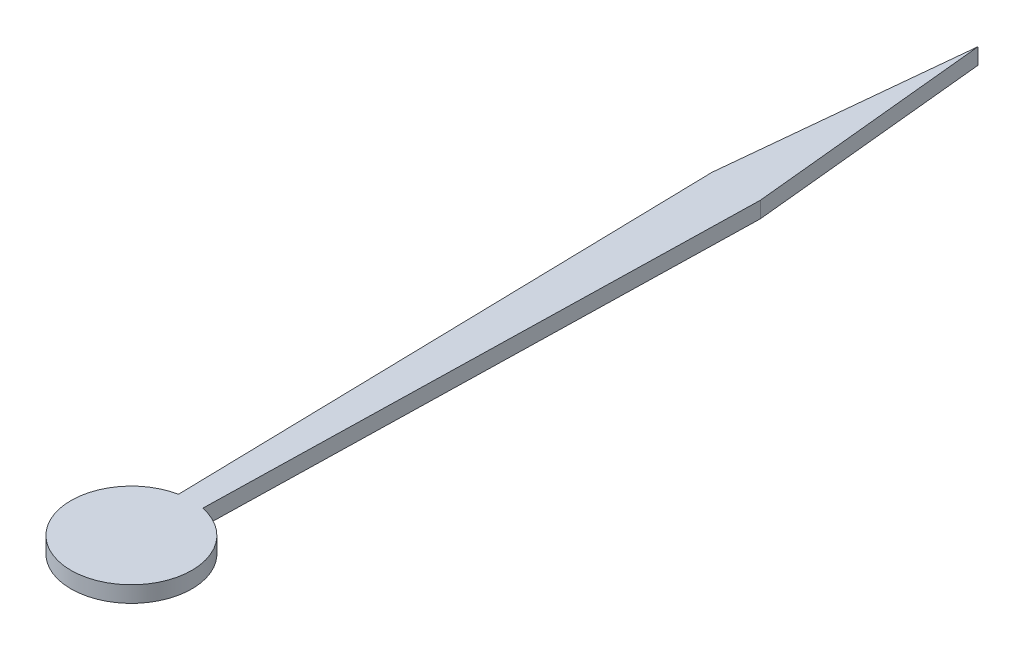
ISO-10303-21;
HEADER;
FILE_DESCRIPTION(('STEP AP214'),'2;1');
FILE_NAME('part.step','',(''),(''),'','','');
FILE_SCHEMA(('AUTOMOTIVE_DESIGN { 1 0 10303 214 1 1 1 1 }'));
ENDSEC;
DATA;
#1=APPLICATION_CONTEXT('core data for automotive mechanical design processes');
#2=APPLICATION_PROTOCOL_DEFINITION('international standard','automotive_design',2000,#1);
#3=PRODUCT_CONTEXT('',#1,'mechanical');
#4=PRODUCT('Part','Part','',(#3));
#5=PRODUCT_RELATED_PRODUCT_CATEGORY('part','',(#4));
#6=PRODUCT_DEFINITION_FORMATION('','',#4);
#7=PRODUCT_DEFINITION_CONTEXT('part definition',#1,'design');
#8=PRODUCT_DEFINITION('design','',#6,#7);
#9=PRODUCT_DEFINITION_SHAPE('','',#8);
#10=(LENGTH_UNIT() NAMED_UNIT(*) SI_UNIT(.MILLI.,.METRE.));
#11=(NAMED_UNIT(*) PLANE_ANGLE_UNIT() SI_UNIT($,.RADIAN.));
#12=(NAMED_UNIT(*) SI_UNIT($,.STERADIAN.) SOLID_ANGLE_UNIT());
#13=UNCERTAINTY_MEASURE_WITH_UNIT(LENGTH_MEASURE(1.E-05),#10,'distance_accuracy_value','');
#14=(GEOMETRIC_REPRESENTATION_CONTEXT(3) GLOBAL_UNCERTAINTY_ASSIGNED_CONTEXT((#13)) GLOBAL_UNIT_ASSIGNED_CONTEXT((#10,
#11,#12)) REPRESENTATION_CONTEXT('',''));
#15=CARTESIAN_POINT('',(0.,0.,0.));
#16=DIRECTION('',(0.,0.,1.));
#17=DIRECTION('',(1.,0.,0.));
#18=AXIS2_PLACEMENT_3D('',#15,#16,#17);
#19=CARTESIAN_POINT('',(0.,0.2,-10.5));
#20=DIRECTION('',(0.995037190209989,0.,0.0995037190209989));
#21=DIRECTION('',(0.0995037190209989,0.,-0.995037190209989));
#22=AXIS2_PLACEMENT_3D('',#19,#20,#21);
#23=PLANE('',#22);
#24=DIRECTION('',(-0.0995037190209989,0.,0.995037190209989));
#25=VECTOR('',#24,1.);
#26=CARTESIAN_POINT('',(0.,0.,-10.5));
#27=LINE('',#26,#25);
#28=CARTESIAN_POINT('',(0.,0.,-10.5));
#29=VERTEX_POINT('',#28);
#30=CARTESIAN_POINT('',(-0.3,0.,-7.5));
#31=VERTEX_POINT('',#30);
#32=EDGE_CURVE('E111',#29,#31,#27,.T.);
#33=ORIENTED_EDGE('',*,*,#32,.T.);
#34=DIRECTION('',(0.,-1.,0.));
#35=VECTOR('',#34,1.);
#36=CARTESIAN_POINT('',(-0.3,0.2,-7.5));
#37=LINE('',#36,#35);
#38=CARTESIAN_POINT('',(-0.3,0.2,-7.5));
#39=VERTEX_POINT('',#38);
#40=EDGE_CURVE('E11',#39,#31,#37,.T.);
#41=ORIENTED_EDGE('',*,*,#40,.F.);
#42=DIRECTION('',(-0.0995037190209989,0.,0.995037190209989));
#43=VECTOR('',#42,1.);
#44=CARTESIAN_POINT('',(0.,0.2,-10.5));
#45=LINE('',#44,#43);
#46=CARTESIAN_POINT('',(0.,0.2,-10.5));
#47=VERTEX_POINT('',#46);
#48=EDGE_CURVE('E119',#47,#39,#45,.T.);
#49=ORIENTED_EDGE('',*,*,#48,.F.);
#50=DIRECTION('',(0.,-1.,0.));
#51=VECTOR('',#50,1.);
#52=CARTESIAN_POINT('',(0.,0.2,-10.5));
#53=LINE('',#52,#51);
#54=EDGE_CURVE('E107',#47,#29,#53,.T.);
#55=ORIENTED_EDGE('',*,*,#54,.T.);
#56=EDGE_LOOP('',(#33,#41,#49,#55));
#57=FACE_BOUND('',#56,.T.);
#58=ADVANCED_FACE('F37',(#57),#23,.F.);
#59=CARTESIAN_POINT('',(-0.3,0.2,-7.5));
#60=DIRECTION('',(0.999754281886394,0.,-0.0221669991162715));
#61=DIRECTION('',(-0.0221669991162715,0.,-0.999754281886394));
#62=AXIS2_PLACEMENT_3D('',#59,#60,#61);
#63=PLANE('',#62);
#64=DIRECTION('',(0.0221669991162715,0.,0.999754281886394));
#65=VECTOR('',#64,1.);
#66=CARTESIAN_POINT('',(-0.3,0.,-7.5));
#67=LINE('',#66,#65);
#68=CARTESIAN_POINT('',(-0.15,0.,-0.734846922834953));
#69=VERTEX_POINT('',#68);
#70=EDGE_CURVE('E114',#31,#69,#67,.T.);
#71=ORIENTED_EDGE('',*,*,#70,.T.);
#72=DIRECTION('',(0.,-1.,0.));
#73=VECTOR('',#72,1.);
#74=CARTESIAN_POINT('',(-0.15,0.2,-0.734846922834953));
#75=LINE('',#74,#73);
#76=CARTESIAN_POINT('',(-0.15,0.2,-0.734846922834953));
#77=VERTEX_POINT('',#76);
#78=EDGE_CURVE('E45',#77,#69,#75,.T.);
#79=ORIENTED_EDGE('',*,*,#78,.F.);
#80=DIRECTION('',(0.0221669991162715,0.,0.999754281886394));
#81=VECTOR('',#80,1.);
#82=CARTESIAN_POINT('',(-0.3,0.2,-7.5));
#83=LINE('',#82,#81);
#84=EDGE_CURVE('E87',#39,#77,#83,.T.);
#85=ORIENTED_EDGE('',*,*,#84,.F.);
#86=ORIENTED_EDGE('',*,*,#40,.T.);
#87=EDGE_LOOP('',(#71,#79,#85,#86));
#88=FACE_BOUND('',#87,.T.);
#89=ADVANCED_FACE('F138',(#88),#63,.F.);
#90=CARTESIAN_POINT('',(0.,0.2,0.));
#91=DIRECTION('',(0.,-1.,0.));
#92=DIRECTION('',(0.,0.,-1.));
#93=AXIS2_PLACEMENT_3D('',#90,#91,#92);
#94=CYLINDRICAL_SURFACE('',#93,0.75);
#95=CARTESIAN_POINT('',(0.,0.,0.));
#96=DIRECTION('',(0.,1.,0.));
#97=DIRECTION('',(0.,0.,1.));
#98=AXIS2_PLACEMENT_3D('',#95,#96,#97);
#99=CIRCLE('',#98,0.75);
#100=CARTESIAN_POINT('',(0.15,0.,-0.734846922834953));
#101=VERTEX_POINT('',#100);
#102=EDGE_CURVE('E102',#69,#101,#99,.T.);
#103=ORIENTED_EDGE('',*,*,#102,.T.);
#104=DIRECTION('',(0.,-1.,0.));
#105=VECTOR('',#104,1.);
#106=CARTESIAN_POINT('',(0.15,0.2,-0.734846922834953));
#107=LINE('',#106,#105);
#108=CARTESIAN_POINT('',(0.15,0.2,-0.734846922834953));
#109=VERTEX_POINT('',#108);
#110=EDGE_CURVE('E99',#109,#101,#107,.T.);
#111=ORIENTED_EDGE('',*,*,#110,.F.);
#112=CARTESIAN_POINT('',(0.,0.2,0.));
#113=DIRECTION('',(0.,1.,0.));
#114=DIRECTION('',(0.,0.,1.));
#115=AXIS2_PLACEMENT_3D('',#112,#113,#114);
#116=CIRCLE('',#115,0.75);
#117=EDGE_CURVE('E91',#77,#109,#116,.T.);
#118=ORIENTED_EDGE('',*,*,#117,.F.);
#119=ORIENTED_EDGE('',*,*,#78,.T.);
#120=EDGE_LOOP('',(#103,#111,#118,#119));
#121=FACE_BOUND('',#120,.T.);
#122=ADVANCED_FACE('F100',(#121),#94,.T.);
#123=CARTESIAN_POINT('',(0.3,0.2,-7.5));
#124=DIRECTION('',(-0.999754281886394,0.,-0.0221669991162715));
#125=DIRECTION('',(-0.0221669991162715,0.,0.999754281886394));
#126=AXIS2_PLACEMENT_3D('',#123,#124,#125);
#127=PLANE('',#126);
#128=DIRECTION('',(0.0221669991162715,0.,-0.999754281886394));
#129=VECTOR('',#128,1.);
#130=CARTESIAN_POINT('',(0.3,0.,-7.5));
#131=LINE('',#130,#129);
#132=CARTESIAN_POINT('',(0.3,0.,-7.5));
#133=VERTEX_POINT('',#132);
#134=EDGE_CURVE('E73',#101,#133,#131,.T.);
#135=ORIENTED_EDGE('',*,*,#134,.T.);
#136=DIRECTION('',(0.,-1.,0.));
#137=VECTOR('',#136,1.);
#138=CARTESIAN_POINT('',(0.3,0.2,-7.5));
#139=LINE('',#138,#137);
#140=CARTESIAN_POINT('',(0.3,0.2,-7.5));
#141=VERTEX_POINT('',#140);
#142=EDGE_CURVE('E103',#141,#133,#139,.T.);
#143=ORIENTED_EDGE('',*,*,#142,.F.);
#144=DIRECTION('',(0.0221669991162715,0.,-0.999754281886394));
#145=VECTOR('',#144,1.);
#146=CARTESIAN_POINT('',(0.3,0.2,-7.5));
#147=LINE('',#146,#145);
#148=EDGE_CURVE('E95',#109,#141,#147,.T.);
#149=ORIENTED_EDGE('',*,*,#148,.F.);
#150=ORIENTED_EDGE('',*,*,#110,.T.);
#151=EDGE_LOOP('',(#135,#143,#149,#150));
#152=FACE_BOUND('',#151,.T.);
#153=ADVANCED_FACE('F105',(#152),#127,.F.);
#154=CARTESIAN_POINT('',(0.,0.2,-10.5));
#155=DIRECTION('',(-0.995037190209989,0.,0.0995037190209989));
#156=DIRECTION('',(0.0995037190209989,0.,0.995037190209989));
#157=AXIS2_PLACEMENT_3D('',#154,#155,#156);
#158=PLANE('',#157);
#159=DIRECTION('',(-0.0995037190209989,0.,-0.995037190209989));
#160=VECTOR('',#159,1.);
#161=CARTESIAN_POINT('',(0.,0.,-10.5));
#162=LINE('',#161,#160);
#163=EDGE_CURVE('E79',#133,#29,#162,.T.);
#164=ORIENTED_EDGE('',*,*,#163,.T.);
#165=ORIENTED_EDGE('',*,*,#54,.F.);
#166=DIRECTION('',(-0.0995037190209989,0.,-0.995037190209989));
#167=VECTOR('',#166,1.);
#168=CARTESIAN_POINT('',(0.,0.2,-10.5));
#169=LINE('',#168,#167);
#170=EDGE_CURVE('E53',#141,#47,#169,.T.);
#171=ORIENTED_EDGE('',*,*,#170,.F.);
#172=ORIENTED_EDGE('',*,*,#142,.T.);
#173=EDGE_LOOP('',(#164,#165,#171,#172));
#174=FACE_BOUND('',#173,.T.);
#175=ADVANCED_FACE('F127',(#174),#158,.F.);
#176=CARTESIAN_POINT('',(0.,0.2,0.));
#177=DIRECTION('',(0.,1.,0.));
#178=DIRECTION('',(0.,0.,1.));
#179=AXIS2_PLACEMENT_3D('',#176,#177,#178);
#180=PLANE('',#179);
#181=ORIENTED_EDGE('',*,*,#48,.T.);
#182=ORIENTED_EDGE('',*,*,#84,.T.);
#183=ORIENTED_EDGE('',*,*,#117,.T.);
#184=ORIENTED_EDGE('',*,*,#148,.T.);
#185=ORIENTED_EDGE('',*,*,#170,.T.);
#186=EDGE_LOOP('',(#181,#182,#183,#184,#185));
#187=FACE_BOUND('',#186,.T.);
#188=ADVANCED_FACE('F93',(#187),#180,.T.);
#189=CARTESIAN_POINT('',(0.,0.,0.));
#190=DIRECTION('',(0.,1.,0.));
#191=DIRECTION('',(0.,0.,1.));
#192=AXIS2_PLACEMENT_3D('',#189,#190,#191);
#193=PLANE('',#192);
#194=ORIENTED_EDGE('',*,*,#32,.F.);
#195=ORIENTED_EDGE('',*,*,#163,.F.);
#196=ORIENTED_EDGE('',*,*,#134,.F.);
#197=ORIENTED_EDGE('',*,*,#102,.F.);
#198=ORIENTED_EDGE('',*,*,#70,.F.);
#199=EDGE_LOOP('',(#194,#195,#196,#197,#198));
#200=FACE_BOUND('',#199,.T.);
#201=ADVANCED_FACE('F123',(#200),#193,.F.);
#202=CLOSED_SHELL('',(#58,#89,#122,#153,#175,#188,#201));
#203=MANIFOLD_SOLID_BREP('B2',#202);
#204=ADVANCED_BREP_SHAPE_REPRESENTATION('',(#18,#203),#14);
#205=SHAPE_DEFINITION_REPRESENTATION(#9,#204);
ENDSEC;
END-ISO-10303-21;
